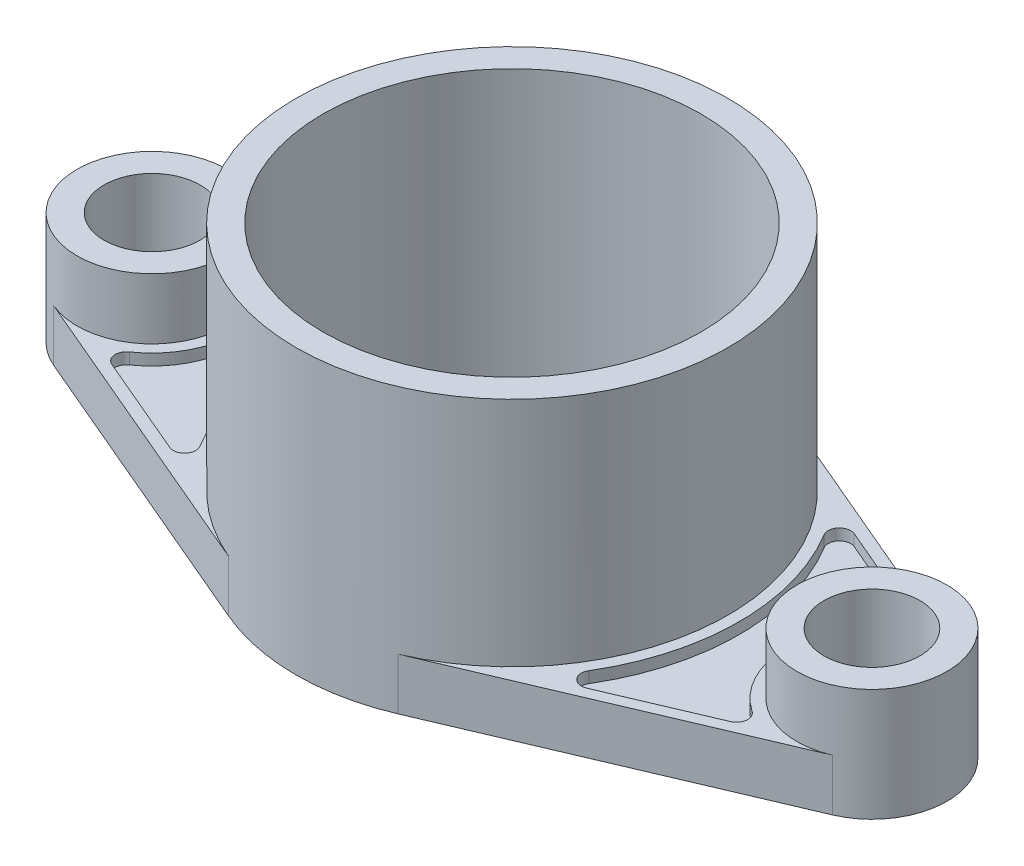
ISO-10303-21;
HEADER;
FILE_DESCRIPTION(('STEP AP214'),'2;1');
FILE_NAME('part.step','',(''),(''),'','','');
FILE_SCHEMA(('AUTOMOTIVE_DESIGN { 1 0 10303 214 1 1 1 1 }'));
ENDSEC;
DATA;
#1=APPLICATION_CONTEXT('core data for automotive mechanical design processes');
#2=APPLICATION_PROTOCOL_DEFINITION('international standard','automotive_design',2000,#1);
#3=PRODUCT_CONTEXT('',#1,'mechanical');
#4=PRODUCT('Part','Part','',(#3));
#5=PRODUCT_RELATED_PRODUCT_CATEGORY('part','',(#4));
#6=PRODUCT_DEFINITION_FORMATION('','',#4);
#7=PRODUCT_DEFINITION_CONTEXT('part definition',#1,'design');
#8=PRODUCT_DEFINITION('design','',#6,#7);
#9=PRODUCT_DEFINITION_SHAPE('','',#8);
#10=(LENGTH_UNIT() NAMED_UNIT(*) SI_UNIT(.MILLI.,.METRE.));
#11=(NAMED_UNIT(*) PLANE_ANGLE_UNIT() SI_UNIT($,.RADIAN.));
#12=(NAMED_UNIT(*) SI_UNIT($,.STERADIAN.) SOLID_ANGLE_UNIT());
#13=UNCERTAINTY_MEASURE_WITH_UNIT(LENGTH_MEASURE(1.E-05),#10,'distance_accuracy_value','');
#14=(GEOMETRIC_REPRESENTATION_CONTEXT(3) GLOBAL_UNCERTAINTY_ASSIGNED_CONTEXT((#13)) GLOBAL_UNIT_ASSIGNED_CONTEXT((#10,
#11,#12)) REPRESENTATION_CONTEXT('',''));
#15=CARTESIAN_POINT('',(0.,0.,0.));
#16=DIRECTION('',(0.,0.,1.));
#17=DIRECTION('',(1.,0.,0.));
#18=AXIS2_PLACEMENT_3D('',#15,#16,#17);
#19=CARTESIAN_POINT('',(-80.,25.,0.));
#20=DIRECTION('',(0.,-1.,0.));
#21=DIRECTION('',(0.,0.,-1.));
#22=AXIS2_PLACEMENT_3D('',#19,#20,#21);
#23=CYLINDRICAL_SURFACE('',#22,16.6666666666667);
#24=CARTESIAN_POINT('',(-80.,25.,0.));
#25=DIRECTION('',(0.,1.,0.));
#26=DIRECTION('',(0.,0.,1.));
#27=AXIS2_PLACEMENT_3D('',#24,#25,#26);
#28=CIRCLE('',#27,16.6666666666667);
#29=CARTESIAN_POINT('',(-80.,25.,16.6666666666667));
#30=VERTEX_POINT('',#29);
#31=EDGE_CURVE('E318',#30,#30,#28,.T.);
#32=ORIENTED_EDGE('',*,*,#31,.F.);
#33=EDGE_LOOP('',(#32));
#34=FACE_BOUND('',#33,.T.);
#35=DIRECTION('',(0.,-1.,0.));
#36=VECTOR('',#35,1.);
#37=CARTESIAN_POINT('',(-86.5277777777778,9.,15.3351196624522));
#38=LINE('',#37,#36);
#39=CARTESIAN_POINT('',(-86.5277777777778,11.5,15.3351196624522));
#40=VERTEX_POINT('',#39);
#41=CARTESIAN_POINT('',(-86.5277777777778,0.,15.3351196624522));
#42=VERTEX_POINT('',#41);
#43=EDGE_CURVE('E343',#40,#42,#38,.T.);
#44=ORIENTED_EDGE('',*,*,#43,.F.);
#45=CARTESIAN_POINT('',(-80.,11.5,0.));
#46=DIRECTION('',(0.,-1.,0.));
#47=DIRECTION('',(0.,0.,1.));
#48=AXIS2_PLACEMENT_3D('',#45,#46,#47);
#49=CIRCLE('',#48,16.6666666666667);
#50=CARTESIAN_POINT('',(-86.5277777777778,11.5,-15.3351196624522));
#51=VERTEX_POINT('',#50);
#52=EDGE_CURVE('E279',#51,#40,#49,.T.);
#53=ORIENTED_EDGE('',*,*,#52,.F.);
#54=DIRECTION('',(0.,-1.,0.));
#55=VECTOR('',#54,1.);
#56=CARTESIAN_POINT('',(-86.5277777777778,9.,-15.3351196624522));
#57=LINE('',#56,#55);
#58=CARTESIAN_POINT('',(-86.5277777777778,0.,-15.3351196624522));
#59=VERTEX_POINT('',#58);
#60=EDGE_CURVE('E332',#51,#59,#57,.T.);
#61=ORIENTED_EDGE('',*,*,#60,.T.);
#62=CARTESIAN_POINT('',(-80.,0.,0.));
#63=DIRECTION('',(0.,1.,0.));
#64=DIRECTION('',(0.,0.,1.));
#65=AXIS2_PLACEMENT_3D('',#62,#63,#64);
#66=CIRCLE('',#65,16.6666666666667);
#67=EDGE_CURVE('E314',#59,#42,#66,.T.);
#68=ORIENTED_EDGE('',*,*,#67,.T.);
#69=EDGE_LOOP('',(#44,#53,#61,#68));
#70=FACE_BOUND('',#69,.T.);
#71=ADVANCED_FACE('F43',(#34,#70),#23,.T.);
#72=CARTESIAN_POINT('',(0.,63.,0.));
#73=DIRECTION('',(0.,1.,0.));
#74=DIRECTION('',(0.,0.,1.));
#75=AXIS2_PLACEMENT_3D('',#72,#73,#74);
#76=PLANE('',#75);
#77=CARTESIAN_POINT('',(0.,63.,0.));
#78=DIRECTION('',(0.,1.,0.));
#79=DIRECTION('',(0.,0.,1.));
#80=AXIS2_PLACEMENT_3D('',#77,#78,#79);
#81=CIRCLE('',#80,48.);
#82=CARTESIAN_POINT('',(0.,63.,48.));
#83=VERTEX_POINT('',#82);
#84=EDGE_CURVE('E356',#83,#83,#81,.T.);
#85=ORIENTED_EDGE('',*,*,#84,.T.);
#86=EDGE_LOOP('',(#85));
#87=FACE_BOUND('',#86,.T.);
#88=CARTESIAN_POINT('',(0.,63.,0.));
#89=DIRECTION('',(0.,1.,0.));
#90=DIRECTION('',(0.,0.,1.));
#91=AXIS2_PLACEMENT_3D('',#88,#89,#90);
#92=CIRCLE('',#91,42.);
#93=CARTESIAN_POINT('',(0.,63.,42.));
#94=VERTEX_POINT('',#93);
#95=EDGE_CURVE('E348',#94,#94,#92,.T.);
#96=ORIENTED_EDGE('',*,*,#95,.F.);
#97=EDGE_LOOP('',(#96));
#98=FACE_BOUND('',#97,.T.);
#99=ADVANCED_FACE('F495',(#87,#98),#76,.T.);
#100=CARTESIAN_POINT('',(0.,0.,0.));
#101=DIRECTION('',(0.,1.,0.));
#102=DIRECTION('',(0.,0.,1.));
#103=AXIS2_PLACEMENT_3D('',#100,#101,#102);
#104=PLANE('',#103);
#105=CARTESIAN_POINT('',(0.,0.,0.));
#106=DIRECTION('',(0.,1.,0.));
#107=DIRECTION('',(0.,0.,1.));
#108=AXIS2_PLACEMENT_3D('',#105,#106,#107);
#109=CIRCLE('',#108,48.);
#110=CARTESIAN_POINT('',(-18.8,0.,44.1651446278624));
#111=VERTEX_POINT('',#110);
#112=CARTESIAN_POINT('',(18.8,0.,44.1651446278624));
#113=VERTEX_POINT('',#112);
#114=EDGE_CURVE('E361',#111,#113,#109,.T.);
#115=ORIENTED_EDGE('',*,*,#114,.F.);
#116=DIRECTION('',(0.920107179747133,0.,0.391666666666667));
#117=VECTOR('',#116,1.);
#118=CARTESIAN_POINT('',(-18.8,0.,44.1651446278624));
#119=LINE('',#118,#117);
#120=EDGE_CURVE('E322',#42,#111,#119,.T.);
#121=ORIENTED_EDGE('',*,*,#120,.F.);
#122=ORIENTED_EDGE('',*,*,#67,.F.);
#123=DIRECTION('',(-0.920107179747133,0.,0.391666666666667));
#124=VECTOR('',#123,1.);
#125=CARTESIAN_POINT('',(-86.5277777777778,0.,-15.3351196624522));
#126=LINE('',#125,#124);
#127=CARTESIAN_POINT('',(-18.8,0.,-44.1651446278624));
#128=VERTEX_POINT('',#127);
#129=EDGE_CURVE('E328',#128,#59,#126,.T.);
#130=ORIENTED_EDGE('',*,*,#129,.F.);
#131=CARTESIAN_POINT('',(18.8,0.,-44.1651446278624));
#132=VERTEX_POINT('',#131);
#133=EDGE_CURVE('E352',#132,#128,#109,.T.);
#134=ORIENTED_EDGE('',*,*,#133,.F.);
#135=DIRECTION('',(0.920107179747133,0.,0.391666666666667));
#136=VECTOR('',#135,1.);
#137=CARTESIAN_POINT('',(86.5277777777778,0.,-15.3351196624522));
#138=LINE('',#137,#136);
#139=CARTESIAN_POINT('',(86.5277777777778,0.,-15.3351196624522));
#140=VERTEX_POINT('',#139);
#141=EDGE_CURVE('E217',#132,#140,#138,.T.);
#142=ORIENTED_EDGE('',*,*,#141,.T.);
#143=CARTESIAN_POINT('',(80.,0.,0.));
#144=DIRECTION('',(0.,-1.,0.));
#145=DIRECTION('',(0.,0.,1.));
#146=AXIS2_PLACEMENT_3D('',#143,#144,#145);
#147=CIRCLE('',#146,16.6666666666667);
#148=CARTESIAN_POINT('',(86.5277777777778,0.,15.3351196624522));
#149=VERTEX_POINT('',#148);
#150=EDGE_CURVE('E584',#140,#149,#147,.T.);
#151=ORIENTED_EDGE('',*,*,#150,.T.);
#152=DIRECTION('',(-0.920107179747133,0.,0.391666666666667));
#153=VECTOR('',#152,1.);
#154=CARTESIAN_POINT('',(18.8,0.,44.1651446278624));
#155=LINE('',#154,#153);
#156=EDGE_CURVE('E223',#149,#113,#155,.T.);
#157=ORIENTED_EDGE('',*,*,#156,.T.);
#158=EDGE_LOOP('',(#115,#121,#122,#130,#134,#142,#151,#157));
#159=FACE_BOUND('',#158,.T.);
#160=CARTESIAN_POINT('',(0.,0.,0.));
#161=DIRECTION('',(0.,1.,0.));
#162=DIRECTION('',(0.,0.,1.));
#163=AXIS2_PLACEMENT_3D('',#160,#161,#162);
#164=CIRCLE('',#163,42.);
#165=CARTESIAN_POINT('',(0.,0.,42.));
#166=VERTEX_POINT('',#165);
#167=EDGE_CURVE('E347',#166,#166,#164,.T.);
#168=ORIENTED_EDGE('',*,*,#167,.T.);
#169=EDGE_LOOP('',(#168));
#170=FACE_BOUND('',#169,.T.);
#171=CARTESIAN_POINT('',(-80.,0.,0.));
#172=DIRECTION('',(0.,1.,0.));
#173=DIRECTION('',(0.,0.,1.));
#174=AXIS2_PLACEMENT_3D('',#171,#172,#173);
#175=CIRCLE('',#174,10.6666666666667);
#176=CARTESIAN_POINT('',(-80.,0.,10.6666666666667));
#177=VERTEX_POINT('',#176);
#178=EDGE_CURVE('E309',#177,#177,#175,.T.);
#179=ORIENTED_EDGE('',*,*,#178,.T.);
#180=EDGE_LOOP('',(#179));
#181=FACE_BOUND('',#180,.T.);
#182=CARTESIAN_POINT('',(80.,0.,0.));
#183=DIRECTION('',(0.,-1.,0.));
#184=DIRECTION('',(0.,0.,1.));
#185=AXIS2_PLACEMENT_3D('',#182,#183,#184);
#186=CIRCLE('',#185,10.6666666666667);
#187=CARTESIAN_POINT('',(80.,0.,10.6666666666667));
#188=VERTEX_POINT('',#187);
#189=EDGE_CURVE('E577',#188,#188,#186,.T.);
#190=ORIENTED_EDGE('',*,*,#189,.F.);
#191=EDGE_LOOP('',(#190));
#192=FACE_BOUND('',#191,.T.);
#193=ADVANCED_FACE('F472',(#159,#170,#181,#192),#104,.F.);
#194=CARTESIAN_POINT('',(0.,63.,0.));
#195=DIRECTION('',(0.,-1.,0.));
#196=DIRECTION('',(0.,0.,-1.));
#197=AXIS2_PLACEMENT_3D('',#194,#195,#196);
#198=CYLINDRICAL_SURFACE('',#197,48.);
#199=CARTESIAN_POINT('',(0.,11.5,0.));
#200=DIRECTION('',(0.,1.,0.));
#201=DIRECTION('',(0.,0.,1.));
#202=AXIS2_PLACEMENT_3D('',#199,#200,#201);
#203=CIRCLE('',#202,48.);
#204=CARTESIAN_POINT('',(18.8,11.5,44.1651446278624));
#205=VERTEX_POINT('',#204);
#206=CARTESIAN_POINT('',(18.8,11.5,-44.1651446278624));
#207=VERTEX_POINT('',#206);
#208=EDGE_CURVE('E213',#205,#207,#203,.T.);
#209=ORIENTED_EDGE('',*,*,#208,.T.);
#210=DIRECTION('',(0.,-1.,0.));
#211=VECTOR('',#210,1.);
#212=CARTESIAN_POINT('',(18.8,9.,-44.1651446278624));
#213=LINE('',#212,#211);
#214=EDGE_CURVE('E255',#207,#132,#213,.T.);
#215=ORIENTED_EDGE('',*,*,#214,.T.);
#216=ORIENTED_EDGE('',*,*,#133,.T.);
#217=DIRECTION('',(0.,-1.,0.));
#218=VECTOR('',#217,1.);
#219=CARTESIAN_POINT('',(-18.8,9.,-44.1651446278624));
#220=LINE('',#219,#218);
#221=CARTESIAN_POINT('',(-18.8,11.5,-44.1651446278624));
#222=VERTEX_POINT('',#221);
#223=EDGE_CURVE('E335',#222,#128,#220,.T.);
#224=ORIENTED_EDGE('',*,*,#223,.F.);
#225=CARTESIAN_POINT('',(0.,11.5,0.));
#226=DIRECTION('',(0.,-1.,0.));
#227=DIRECTION('',(0.,0.,1.));
#228=AXIS2_PLACEMENT_3D('',#225,#226,#227);
#229=CIRCLE('',#228,48.);
#230=CARTESIAN_POINT('',(-18.8,11.5,44.1651446278624));
#231=VERTEX_POINT('',#230);
#232=EDGE_CURVE('E301',#231,#222,#229,.T.);
#233=ORIENTED_EDGE('',*,*,#232,.F.);
#234=DIRECTION('',(0.,-1.,0.));
#235=VECTOR('',#234,1.);
#236=CARTESIAN_POINT('',(-18.8,9.,44.1651446278624));
#237=LINE('',#236,#235);
#238=EDGE_CURVE('E339',#231,#111,#237,.T.);
#239=ORIENTED_EDGE('',*,*,#238,.T.);
#240=ORIENTED_EDGE('',*,*,#114,.T.);
#241=DIRECTION('',(0.,-1.,0.));
#242=VECTOR('',#241,1.);
#243=CARTESIAN_POINT('',(18.8,9.,44.1651446278624));
#244=LINE('',#243,#242);
#245=EDGE_CURVE('E228',#205,#113,#244,.T.);
#246=ORIENTED_EDGE('',*,*,#245,.F.);
#247=EDGE_LOOP('',(#209,#215,#216,#224,#233,#239,#240,#246));
#248=FACE_BOUND('',#247,.T.);
#249=ORIENTED_EDGE('',*,*,#84,.F.);
#250=EDGE_LOOP('',(#249));
#251=FACE_BOUND('',#250,.T.);
#252=ADVANCED_FACE('F462',(#248,#251),#198,.T.);
#253=CARTESIAN_POINT('',(0.,63.,0.));
#254=DIRECTION('',(0.,-1.,0.));
#255=DIRECTION('',(0.,0.,-1.));
#256=AXIS2_PLACEMENT_3D('',#253,#254,#255);
#257=CYLINDRICAL_SURFACE('',#256,42.);
#258=ORIENTED_EDGE('',*,*,#95,.T.);
#259=EDGE_LOOP('',(#258));
#260=FACE_BOUND('',#259,.T.);
#261=ORIENTED_EDGE('',*,*,#167,.F.);
#262=EDGE_LOOP('',(#261));
#263=FACE_BOUND('',#262,.T.);
#264=ADVANCED_FACE('F484',(#260,#263),#257,.F.);
#265=CARTESIAN_POINT('',(-18.8,9.,44.1651446278624));
#266=DIRECTION('',(0.391666666666667,0.,-0.920107179747133));
#267=DIRECTION('',(-0.920107179747133,0.,-0.391666666666667));
#268=AXIS2_PLACEMENT_3D('',#265,#266,#267);
#269=PLANE('',#268);
#270=ORIENTED_EDGE('',*,*,#120,.T.);
#271=ORIENTED_EDGE('',*,*,#238,.F.);
#272=DIRECTION('',(0.920107179747133,0.,0.391666666666667));
#273=VECTOR('',#272,1.);
#274=CARTESIAN_POINT('',(-86.5277777777778,11.5,15.3351196624522));
#275=LINE('',#274,#273);
#276=EDGE_CURVE('E297',#40,#231,#275,.T.);
#277=ORIENTED_EDGE('',*,*,#276,.F.);
#278=ORIENTED_EDGE('',*,*,#43,.T.);
#279=EDGE_LOOP('',(#270,#271,#277,#278));
#280=FACE_BOUND('',#279,.T.);
#281=ADVANCED_FACE('F482',(#280),#269,.F.);
#282=CARTESIAN_POINT('',(-86.5277777777778,9.,-15.3351196624522));
#283=DIRECTION('',(0.391666666666667,0.,0.920107179747132));
#284=DIRECTION('',(0.920107179747133,0.,-0.391666666666667));
#285=AXIS2_PLACEMENT_3D('',#282,#283,#284);
#286=PLANE('',#285);
#287=ORIENTED_EDGE('',*,*,#129,.T.);
#288=ORIENTED_EDGE('',*,*,#60,.F.);
#289=DIRECTION('',(-0.920107179747133,0.,0.391666666666667));
#290=VECTOR('',#289,1.);
#291=CARTESIAN_POINT('',(-18.8,11.5,-44.1651446278624));
#292=LINE('',#291,#290);
#293=EDGE_CURVE('E305',#222,#51,#292,.T.);
#294=ORIENTED_EDGE('',*,*,#293,.F.);
#295=ORIENTED_EDGE('',*,*,#223,.T.);
#296=EDGE_LOOP('',(#287,#288,#294,#295));
#297=FACE_BOUND('',#296,.T.);
#298=ADVANCED_FACE('F470',(#297),#286,.F.);
#299=CARTESIAN_POINT('',(-80.,25.,0.));
#300=DIRECTION('',(0.,1.,0.));
#301=DIRECTION('',(0.,0.,1.));
#302=AXIS2_PLACEMENT_3D('',#299,#300,#301);
#303=PLANE('',#302);
#304=ORIENTED_EDGE('',*,*,#31,.T.);
#305=EDGE_LOOP('',(#304));
#306=FACE_BOUND('',#305,.T.);
#307=CARTESIAN_POINT('',(-80.,25.,0.));
#308=DIRECTION('',(0.,1.,0.));
#309=DIRECTION('',(0.,0.,1.));
#310=AXIS2_PLACEMENT_3D('',#307,#308,#309);
#311=CIRCLE('',#310,10.6666666666667);
#312=CARTESIAN_POINT('',(-80.,25.,10.6666666666667));
#313=VERTEX_POINT('',#312);
#314=EDGE_CURVE('E310',#313,#313,#311,.T.);
#315=ORIENTED_EDGE('',*,*,#314,.F.);
#316=EDGE_LOOP('',(#315));
#317=FACE_BOUND('',#316,.T.);
#318=ADVANCED_FACE('F490',(#306,#317),#303,.T.);
#319=CARTESIAN_POINT('',(-80.,25.,0.));
#320=DIRECTION('',(0.,-1.,0.));
#321=DIRECTION('',(0.,0.,-1.));
#322=AXIS2_PLACEMENT_3D('',#319,#320,#321);
#323=CYLINDRICAL_SURFACE('',#322,10.6666666666667);
#324=ORIENTED_EDGE('',*,*,#314,.T.);
#325=EDGE_LOOP('',(#324));
#326=FACE_BOUND('',#325,.T.);
#327=ORIENTED_EDGE('',*,*,#178,.F.);
#328=EDGE_LOOP('',(#327));
#329=FACE_BOUND('',#328,.T.);
#330=ADVANCED_FACE('F559',(#326,#329),#323,.F.);
#331=CARTESIAN_POINT('',(-80.,11.5,0.));
#332=DIRECTION('',(0.,1.,0.));
#333=DIRECTION('',(0.,0.,1.));
#334=AXIS2_PLACEMENT_3D('',#331,#332,#333);
#335=PLANE('',#334);
#336=ORIENTED_EDGE('',*,*,#52,.T.);
#337=ORIENTED_EDGE('',*,*,#276,.T.);
#338=ORIENTED_EDGE('',*,*,#232,.T.);
#339=ORIENTED_EDGE('',*,*,#293,.T.);
#340=EDGE_LOOP('',(#336,#337,#338,#339));
#341=FACE_BOUND('',#340,.T.);
#342=DIRECTION('',(-0.920107179747133,0.,0.391666666666667));
#343=VECTOR('',#342,1.);
#344=CARTESIAN_POINT('',(-37.979371640132,11.5,-33.2838899442469));
#345=LINE('',#344,#343);
#346=CARTESIAN_POINT('',(-46.3293116044255,11.5,-29.729528860378));
#347=VERTEX_POINT('',#346);
#348=CARTESIAN_POINT('',(-68.7498291887789,11.5,-20.185673991624));
#349=VERTEX_POINT('',#348);
#350=EDGE_CURVE('E266',#347,#349,#345,.T.);
#351=ORIENTED_EDGE('',*,*,#350,.F.);
#352=CARTESIAN_POINT('',(-45.3501449377588,11.5,-27.4292609110101));
#353=DIRECTION('',(0.,1.,0.));
#354=DIRECTION('',(0.,0.,1.));
#355=AXIS2_PLACEMENT_3D('',#352,#353,#354);
#356=CIRCLE('',#355,2.5);
#357=CARTESIAN_POINT('',(-43.2109871576759,11.5,-26.13542784917));
#358=VERTEX_POINT('',#357);
#359=EDGE_CURVE('E409',#347,#358,#356,.F.);
#360=ORIENTED_EDGE('',*,*,#359,.T.);
#361=CARTESIAN_POINT('',(0.,11.5,0.));
#362=DIRECTION('',(0.,-1.,0.));
#363=DIRECTION('',(0.,0.,1.));
#364=AXIS2_PLACEMENT_3D('',#361,#362,#363);
#365=CIRCLE('',#364,50.5);
#366=CARTESIAN_POINT('',(-43.2109871576759,11.5,26.13542784917));
#367=VERTEX_POINT('',#366);
#368=EDGE_CURVE('E262',#367,#358,#365,.T.);
#369=ORIENTED_EDGE('',*,*,#368,.F.);
#370=CARTESIAN_POINT('',(-45.3501449377588,11.5,27.4292609110101));
#371=DIRECTION('',(0.,1.,0.));
#372=DIRECTION('',(0.,0.,1.));
#373=AXIS2_PLACEMENT_3D('',#370,#371,#372);
#374=CIRCLE('',#373,2.5);
#375=CARTESIAN_POINT('',(-46.3293116044255,11.5,29.729528860378));
#376=VERTEX_POINT('',#375);
#377=EDGE_CURVE('E403',#367,#376,#374,.F.);
#378=ORIENTED_EDGE('',*,*,#377,.T.);
#379=DIRECTION('',(0.920107179747133,0.,0.391666666666667));
#380=VECTOR('',#379,1.);
#381=CARTESIAN_POINT('',(-73.6700784981561,11.5,18.0912466372996));
#382=LINE('',#381,#380);
#383=CARTESIAN_POINT('',(-68.7498291887789,11.5,20.185673991624));
#384=VERTEX_POINT('',#383);
#385=EDGE_CURVE('E275',#384,#376,#382,.T.);
#386=ORIENTED_EDGE('',*,*,#385,.F.);
#387=CARTESIAN_POINT('',(-67.7706625221123,11.5,17.8854060422562));
#388=DIRECTION('',(0.,1.,0.));
#389=DIRECTION('',(0.,0.,1.));
#390=AXIS2_PLACEMENT_3D('',#387,#388,#389);
#391=CIRCLE('',#390,2.5);
#392=CARTESIAN_POINT('',(-69.181739923407,11.5,15.8217053450728));
#393=VERTEX_POINT('',#392);
#394=EDGE_CURVE('E406',#384,#393,#391,.F.);
#395=ORIENTED_EDGE('',*,*,#394,.T.);
#396=CARTESIAN_POINT('',(-80.,11.5,0.));
#397=DIRECTION('',(0.,-1.,0.));
#398=DIRECTION('',(0.,0.,1.));
#399=AXIS2_PLACEMENT_3D('',#396,#397,#398);
#400=CIRCLE('',#399,19.1666666666667);
#401=CARTESIAN_POINT('',(-69.181739923407,11.5,-15.8217053450728));
#402=VERTEX_POINT('',#401);
#403=EDGE_CURVE('E271',#402,#393,#400,.T.);
#404=ORIENTED_EDGE('',*,*,#403,.F.);
#405=CARTESIAN_POINT('',(-67.7706625221123,11.5,-17.8854060422562));
#406=DIRECTION('',(0.,1.,0.));
#407=DIRECTION('',(0.,0.,1.));
#408=AXIS2_PLACEMENT_3D('',#405,#406,#407);
#409=CIRCLE('',#408,2.5);
#410=EDGE_CURVE('E412',#402,#349,#409,.F.);
#411=ORIENTED_EDGE('',*,*,#410,.T.);
#412=EDGE_LOOP('',(#351,#360,#369,#378,#386,#395,#404,#411));
#413=FACE_BOUND('',#412,.T.);
#414=ADVANCED_FACE('F479',(#341,#413),#335,.T.);
#415=CARTESIAN_POINT('',(0.,11.5,0.));
#416=DIRECTION('',(0.,-1.,0.));
#417=DIRECTION('',(0.,0.,-1.));
#418=AXIS2_PLACEMENT_3D('',#415,#416,#417);
#419=CYLINDRICAL_SURFACE('',#418,50.5);
#420=CARTESIAN_POINT('',(0.,9.,0.));
#421=DIRECTION('',(0.,-1.,0.));
#422=DIRECTION('',(0.,0.,1.));
#423=AXIS2_PLACEMENT_3D('',#420,#421,#422);
#424=CIRCLE('',#423,50.5);
#425=CARTESIAN_POINT('',(-43.2109871576759,9.,26.13542784917));
#426=VERTEX_POINT('',#425);
#427=CARTESIAN_POINT('',(-43.2109871576759,9.,-26.13542784917));
#428=VERTEX_POINT('',#427);
#429=EDGE_CURVE('E261',#426,#428,#424,.T.);
#430=ORIENTED_EDGE('',*,*,#429,.F.);
#431=DIRECTION('',(0.,-1.,0.));
#432=VECTOR('',#431,1.);
#433=CARTESIAN_POINT('',(-43.2109871576759,11.5,26.13542784917));
#434=LINE('',#433,#432);
#435=EDGE_CURVE('E386',#426,#367,#434,.F.);
#436=ORIENTED_EDGE('',*,*,#435,.T.);
#437=ORIENTED_EDGE('',*,*,#368,.T.);
#438=DIRECTION('',(0.,-1.,0.));
#439=VECTOR('',#438,1.);
#440=CARTESIAN_POINT('',(-43.2109871576759,11.5,-26.13542784917));
#441=LINE('',#440,#439);
#442=EDGE_CURVE('E382',#358,#428,#441,.T.);
#443=ORIENTED_EDGE('',*,*,#442,.T.);
#444=EDGE_LOOP('',(#430,#436,#437,#443));
#445=FACE_BOUND('',#444,.T.);
#446=ADVANCED_FACE('F550',(#445),#419,.T.);
#447=CARTESIAN_POINT('',(-37.979371640132,11.5,-33.2838899442469));
#448=DIRECTION('',(0.391666666666667,0.,0.920107179747133));
#449=DIRECTION('',(0.920107179747133,0.,-0.391666666666667));
#450=AXIS2_PLACEMENT_3D('',#447,#448,#449);
#451=PLANE('',#450);
#452=DIRECTION('',(-0.920107179747133,0.,0.391666666666667));
#453=VECTOR('',#452,1.);
#454=CARTESIAN_POINT('',(-37.979371640132,9.,-33.2838899442469));
#455=LINE('',#454,#453);
#456=CARTESIAN_POINT('',(-46.3293116044255,9.,-29.729528860378));
#457=VERTEX_POINT('',#456);
#458=CARTESIAN_POINT('',(-68.7498291887789,9.,-20.185673991624));
#459=VERTEX_POINT('',#458);
#460=EDGE_CURVE('E283',#457,#459,#455,.T.);
#461=ORIENTED_EDGE('',*,*,#460,.F.);
#462=DIRECTION('',(0.,1.,0.));
#463=VECTOR('',#462,1.);
#464=CARTESIAN_POINT('',(-46.3293116044255,11.5,-29.729528860378));
#465=LINE('',#464,#463);
#466=EDGE_CURVE('E400',#457,#347,#465,.T.);
#467=ORIENTED_EDGE('',*,*,#466,.T.);
#468=ORIENTED_EDGE('',*,*,#350,.T.);
#469=DIRECTION('',(0.,1.,0.));
#470=VECTOR('',#469,1.);
#471=CARTESIAN_POINT('',(-68.7498291887789,9.,-20.185673991624));
#472=LINE('',#471,#470);
#473=EDGE_CURVE('E396',#349,#459,#472,.F.);
#474=ORIENTED_EDGE('',*,*,#473,.T.);
#475=EDGE_LOOP('',(#461,#467,#468,#474));
#476=FACE_BOUND('',#475,.T.);
#477=ADVANCED_FACE('F542',(#476),#451,.T.);
#478=CARTESIAN_POINT('',(-80.,11.5,0.));
#479=DIRECTION('',(0.,-1.,0.));
#480=DIRECTION('',(0.,0.,-1.));
#481=AXIS2_PLACEMENT_3D('',#478,#479,#480);
#482=CYLINDRICAL_SURFACE('',#481,19.1666666666667);
#483=ORIENTED_EDGE('',*,*,#403,.T.);
#484=DIRECTION('',(0.,-1.,0.));
#485=VECTOR('',#484,1.);
#486=CARTESIAN_POINT('',(-69.181739923407,11.5,15.8217053450728));
#487=LINE('',#486,#485);
#488=CARTESIAN_POINT('',(-69.181739923407,9.,15.8217053450728));
#489=VERTEX_POINT('',#488);
#490=EDGE_CURVE('E392',#393,#489,#487,.T.);
#491=ORIENTED_EDGE('',*,*,#490,.T.);
#492=CARTESIAN_POINT('',(-80.,9.,0.));
#493=DIRECTION('',(0.,-1.,0.));
#494=DIRECTION('',(0.,0.,1.));
#495=AXIS2_PLACEMENT_3D('',#492,#493,#494);
#496=CIRCLE('',#495,19.1666666666667);
#497=CARTESIAN_POINT('',(-69.181739923407,9.,-15.8217053450728));
#498=VERTEX_POINT('',#497);
#499=EDGE_CURVE('E287',#498,#489,#496,.T.);
#500=ORIENTED_EDGE('',*,*,#499,.F.);
#501=DIRECTION('',(0.,-1.,0.));
#502=VECTOR('',#501,1.);
#503=CARTESIAN_POINT('',(-69.181739923407,11.5,-15.8217053450728));
#504=LINE('',#503,#502);
#505=EDGE_CURVE('E389',#498,#402,#504,.F.);
#506=ORIENTED_EDGE('',*,*,#505,.T.);
#507=EDGE_LOOP('',(#483,#491,#500,#506));
#508=FACE_BOUND('',#507,.T.);
#509=ADVANCED_FACE('F519',(#508),#482,.T.);
#510=CARTESIAN_POINT('',(-73.6700784981561,11.5,18.0912466372996));
#511=DIRECTION('',(0.391666666666667,0.,-0.920107179747133));
#512=DIRECTION('',(-0.920107179747133,0.,-0.391666666666667));
#513=AXIS2_PLACEMENT_3D('',#510,#511,#512);
#514=PLANE('',#513);
#515=ORIENTED_EDGE('',*,*,#385,.T.);
#516=DIRECTION('',(0.,1.,0.));
#517=VECTOR('',#516,1.);
#518=CARTESIAN_POINT('',(-46.3293116044255,9.,29.729528860378));
#519=LINE('',#518,#517);
#520=CARTESIAN_POINT('',(-46.3293116044255,9.,29.729528860378));
#521=VERTEX_POINT('',#520);
#522=EDGE_CURVE('E366',#376,#521,#519,.F.);
#523=ORIENTED_EDGE('',*,*,#522,.T.);
#524=DIRECTION('',(0.920107179747133,0.,0.391666666666667));
#525=VECTOR('',#524,1.);
#526=CARTESIAN_POINT('',(-73.6700784981561,9.,18.0912466372996));
#527=LINE('',#526,#525);
#528=CARTESIAN_POINT('',(-68.7498291887789,9.,20.185673991624));
#529=VERTEX_POINT('',#528);
#530=EDGE_CURVE('E267',#529,#521,#527,.T.);
#531=ORIENTED_EDGE('',*,*,#530,.F.);
#532=DIRECTION('',(0.,1.,0.));
#533=VECTOR('',#532,1.);
#534=CARTESIAN_POINT('',(-68.7498291887789,11.5,20.185673991624));
#535=LINE('',#534,#533);
#536=EDGE_CURVE('E360',#529,#384,#535,.T.);
#537=ORIENTED_EDGE('',*,*,#536,.T.);
#538=EDGE_LOOP('',(#515,#523,#531,#537));
#539=FACE_BOUND('',#538,.T.);
#540=ADVANCED_FACE('F510',(#539),#514,.T.);
#541=CARTESIAN_POINT('',(-80.,9.,0.));
#542=DIRECTION('',(0.,1.,0.));
#543=DIRECTION('',(0.,0.,1.));
#544=AXIS2_PLACEMENT_3D('',#541,#542,#543);
#545=PLANE('',#544);
#546=ORIENTED_EDGE('',*,*,#530,.T.);
#547=CARTESIAN_POINT('',(-45.3501449377588,9.,27.4292609110101));
#548=DIRECTION('',(0.,1.,0.));
#549=DIRECTION('',(0.,0.,1.));
#550=AXIS2_PLACEMENT_3D('',#547,#548,#549);
#551=CIRCLE('',#550,2.5);
#552=EDGE_CURVE('E379',#521,#426,#551,.T.);
#553=ORIENTED_EDGE('',*,*,#552,.T.);
#554=ORIENTED_EDGE('',*,*,#429,.T.);
#555=CARTESIAN_POINT('',(-45.3501449377588,9.,-27.4292609110101));
#556=DIRECTION('',(0.,1.,0.));
#557=DIRECTION('',(0.,0.,1.));
#558=AXIS2_PLACEMENT_3D('',#555,#556,#557);
#559=CIRCLE('',#558,2.5);
#560=EDGE_CURVE('E373',#428,#457,#559,.T.);
#561=ORIENTED_EDGE('',*,*,#560,.T.);
#562=ORIENTED_EDGE('',*,*,#460,.T.);
#563=CARTESIAN_POINT('',(-67.7706625221123,9.,-17.8854060422562));
#564=DIRECTION('',(0.,1.,0.));
#565=DIRECTION('',(0.,0.,1.));
#566=AXIS2_PLACEMENT_3D('',#563,#564,#565);
#567=CIRCLE('',#566,2.5);
#568=EDGE_CURVE('E370',#459,#498,#567,.T.);
#569=ORIENTED_EDGE('',*,*,#568,.T.);
#570=ORIENTED_EDGE('',*,*,#499,.T.);
#571=CARTESIAN_POINT('',(-67.7706625221123,9.,17.8854060422562));
#572=DIRECTION('',(0.,1.,0.));
#573=DIRECTION('',(0.,0.,1.));
#574=AXIS2_PLACEMENT_3D('',#571,#572,#573);
#575=CIRCLE('',#574,2.5);
#576=EDGE_CURVE('E376',#489,#529,#575,.T.);
#577=ORIENTED_EDGE('',*,*,#576,.T.);
#578=EDGE_LOOP('',(#546,#553,#554,#561,#562,#569,#570,#577));
#579=FACE_BOUND('',#578,.T.);
#580=ADVANCED_FACE('F507',(#579),#545,.T.);
#581=CARTESIAN_POINT('',(-45.3501449377588,11.5,27.4292609110101));
#582=DIRECTION('',(0.,-1.,0.));
#583=DIRECTION('',(0.,0.,-1.));
#584=AXIS2_PLACEMENT_3D('',#581,#582,#583);
#585=CYLINDRICAL_SURFACE('',#584,2.5);
#586=ORIENTED_EDGE('',*,*,#377,.F.);
#587=ORIENTED_EDGE('',*,*,#435,.F.);
#588=ORIENTED_EDGE('',*,*,#552,.F.);
#589=ORIENTED_EDGE('',*,*,#522,.F.);
#590=EDGE_LOOP('',(#586,#587,#588,#589));
#591=FACE_BOUND('',#590,.T.);
#592=ADVANCED_FACE('F509',(#591),#585,.F.);
#593=CARTESIAN_POINT('',(-67.7706625221123,11.5,17.8854060422562));
#594=DIRECTION('',(0.,-1.,0.));
#595=DIRECTION('',(0.,0.,-1.));
#596=AXIS2_PLACEMENT_3D('',#593,#594,#595);
#597=CYLINDRICAL_SURFACE('',#596,2.5);
#598=ORIENTED_EDGE('',*,*,#394,.F.);
#599=ORIENTED_EDGE('',*,*,#536,.F.);
#600=ORIENTED_EDGE('',*,*,#576,.F.);
#601=ORIENTED_EDGE('',*,*,#490,.F.);
#602=EDGE_LOOP('',(#598,#599,#600,#601));
#603=FACE_BOUND('',#602,.T.);
#604=ADVANCED_FACE('F516',(#603),#597,.F.);
#605=CARTESIAN_POINT('',(-45.3501449377588,11.5,-27.4292609110101));
#606=DIRECTION('',(0.,-1.,0.));
#607=DIRECTION('',(0.,0.,-1.));
#608=AXIS2_PLACEMENT_3D('',#605,#606,#607);
#609=CYLINDRICAL_SURFACE('',#608,2.5);
#610=ORIENTED_EDGE('',*,*,#359,.F.);
#611=ORIENTED_EDGE('',*,*,#466,.F.);
#612=ORIENTED_EDGE('',*,*,#560,.F.);
#613=ORIENTED_EDGE('',*,*,#442,.F.);
#614=EDGE_LOOP('',(#610,#611,#612,#613));
#615=FACE_BOUND('',#614,.T.);
#616=ADVANCED_FACE('F545',(#615),#609,.F.);
#617=CARTESIAN_POINT('',(-67.7706625221123,11.5,-17.8854060422562));
#618=DIRECTION('',(0.,-1.,0.));
#619=DIRECTION('',(0.,0.,-1.));
#620=AXIS2_PLACEMENT_3D('',#617,#618,#619);
#621=CYLINDRICAL_SURFACE('',#620,2.5);
#622=ORIENTED_EDGE('',*,*,#410,.F.);
#623=ORIENTED_EDGE('',*,*,#505,.F.);
#624=ORIENTED_EDGE('',*,*,#568,.F.);
#625=ORIENTED_EDGE('',*,*,#473,.F.);
#626=EDGE_LOOP('',(#622,#623,#624,#625));
#627=FACE_BOUND('',#626,.T.);
#628=ADVANCED_FACE('F537',(#627),#621,.F.);
#629=CARTESIAN_POINT('',(86.5277777777778,9.,-15.3351196624522));
#630=DIRECTION('',(0.391666666666667,0.,-0.920107179747132));
#631=DIRECTION('',(-0.920107179747133,0.,-0.391666666666667));
#632=AXIS2_PLACEMENT_3D('',#629,#630,#631);
#633=PLANE('',#632);
#634=ORIENTED_EDGE('',*,*,#141,.F.);
#635=ORIENTED_EDGE('',*,*,#214,.F.);
#636=DIRECTION('',(0.920107179747133,0.,0.391666666666667));
#637=VECTOR('',#636,1.);
#638=CARTESIAN_POINT('',(18.8,11.5,-44.1651446278624));
#639=LINE('',#638,#637);
#640=CARTESIAN_POINT('',(86.5277777777778,11.5,-15.3351196624522));
#641=VERTEX_POINT('',#640);
#642=EDGE_CURVE('E234',#207,#641,#639,.T.);
#643=ORIENTED_EDGE('',*,*,#642,.T.);
#644=DIRECTION('',(0.,-1.,0.));
#645=VECTOR('',#644,1.);
#646=CARTESIAN_POINT('',(86.5277777777778,9.,-15.3351196624522));
#647=LINE('',#646,#645);
#648=EDGE_CURVE('E232',#641,#140,#647,.T.);
#649=ORIENTED_EDGE('',*,*,#648,.T.);
#650=EDGE_LOOP('',(#634,#635,#643,#649));
#651=FACE_BOUND('',#650,.T.);
#652=ADVANCED_FACE('F660',(#651),#633,.T.);
#653=CARTESIAN_POINT('',(18.8,9.,44.1651446278624));
#654=DIRECTION('',(0.391666666666667,0.,0.920107179747133));
#655=DIRECTION('',(0.920107179747133,0.,-0.391666666666667));
#656=AXIS2_PLACEMENT_3D('',#653,#654,#655);
#657=PLANE('',#656);
#658=ORIENTED_EDGE('',*,*,#156,.F.);
#659=DIRECTION('',(0.,-1.,0.));
#660=VECTOR('',#659,1.);
#661=CARTESIAN_POINT('',(86.5277777777778,9.,15.3351196624522));
#662=LINE('',#661,#660);
#663=CARTESIAN_POINT('',(86.5277777777778,11.5,15.3351196624522));
#664=VERTEX_POINT('',#663);
#665=EDGE_CURVE('E220',#664,#149,#662,.T.);
#666=ORIENTED_EDGE('',*,*,#665,.F.);
#667=DIRECTION('',(-0.920107179747133,0.,0.391666666666667));
#668=VECTOR('',#667,1.);
#669=CARTESIAN_POINT('',(86.5277777777778,11.5,15.3351196624522));
#670=LINE('',#669,#668);
#671=EDGE_CURVE('E205',#664,#205,#670,.T.);
#672=ORIENTED_EDGE('',*,*,#671,.T.);
#673=ORIENTED_EDGE('',*,*,#245,.T.);
#674=EDGE_LOOP('',(#658,#666,#672,#673));
#675=FACE_BOUND('',#674,.T.);
#676=ADVANCED_FACE('F221',(#675),#657,.T.);
#677=CARTESIAN_POINT('',(80.,11.5,0.));
#678=DIRECTION('',(0.,1.,0.));
#679=DIRECTION('',(0.,0.,1.));
#680=AXIS2_PLACEMENT_3D('',#677,#678,#679);
#681=PLANE('',#680);
#682=DIRECTION('',(-0.920107179747133,0.,0.391666666666667));
#683=VECTOR('',#682,1.);
#684=CARTESIAN_POINT('',(73.6700784981561,11.5,18.0912466372996));
#685=LINE('',#684,#683);
#686=CARTESIAN_POINT('',(68.7498291887789,11.5,20.185673991624));
#687=VERTEX_POINT('',#686);
#688=CARTESIAN_POINT('',(46.3293116044255,11.5,29.729528860378));
#689=VERTEX_POINT('',#688);
#690=EDGE_CURVE('E597',#687,#689,#685,.T.);
#691=ORIENTED_EDGE('',*,*,#690,.T.);
#692=CARTESIAN_POINT('',(45.3501449377588,11.5,27.4292609110101));
#693=DIRECTION('',(0.,1.,0.));
#694=DIRECTION('',(0.,0.,1.));
#695=AXIS2_PLACEMENT_3D('',#692,#693,#694);
#696=CIRCLE('',#695,2.5);
#697=CARTESIAN_POINT('',(43.2109871576759,11.5,26.13542784917));
#698=VERTEX_POINT('',#697);
#699=EDGE_CURVE('E454',#689,#698,#696,.F.);
#700=ORIENTED_EDGE('',*,*,#699,.T.);
#701=CARTESIAN_POINT('',(0.,11.5,0.));
#702=DIRECTION('',(0.,1.,0.));
#703=DIRECTION('',(0.,0.,1.));
#704=AXIS2_PLACEMENT_3D('',#701,#702,#703);
#705=CIRCLE('',#704,50.5);
#706=CARTESIAN_POINT('',(43.2109871576759,11.5,-26.13542784917));
#707=VERTEX_POINT('',#706);
#708=EDGE_CURVE('E594',#698,#707,#705,.T.);
#709=ORIENTED_EDGE('',*,*,#708,.T.);
#710=CARTESIAN_POINT('',(45.3501449377588,11.5,-27.4292609110101));
#711=DIRECTION('',(0.,1.,0.));
#712=DIRECTION('',(0.,0.,1.));
#713=AXIS2_PLACEMENT_3D('',#710,#711,#712);
#714=CIRCLE('',#713,2.5);
#715=CARTESIAN_POINT('',(46.3293116044255,11.5,-29.729528860378));
#716=VERTEX_POINT('',#715);
#717=EDGE_CURVE('E52',#707,#716,#714,.F.);
#718=ORIENTED_EDGE('',*,*,#717,.T.);
#719=DIRECTION('',(0.920107179747133,0.,0.391666666666667));
#720=VECTOR('',#719,1.);
#721=CARTESIAN_POINT('',(37.979371640132,11.5,-33.2838899442469));
#722=LINE('',#721,#720);
#723=CARTESIAN_POINT('',(68.7498291887789,11.5,-20.185673991624));
#724=VERTEX_POINT('',#723);
#725=EDGE_CURVE('E235',#716,#724,#722,.T.);
#726=ORIENTED_EDGE('',*,*,#725,.T.);
#727=CARTESIAN_POINT('',(67.7706625221123,11.5,-17.8854060422562));
#728=DIRECTION('',(0.,1.,0.));
#729=DIRECTION('',(0.,0.,1.));
#730=AXIS2_PLACEMENT_3D('',#727,#728,#729);
#731=CIRCLE('',#730,2.5);
#732=CARTESIAN_POINT('',(69.181739923407,11.5,-15.8217053450728));
#733=VERTEX_POINT('',#732);
#734=EDGE_CURVE('E11',#724,#733,#731,.F.);
#735=ORIENTED_EDGE('',*,*,#734,.T.);
#736=CARTESIAN_POINT('',(80.,11.5,0.));
#737=DIRECTION('',(0.,1.,0.));
#738=DIRECTION('',(0.,0.,1.));
#739=AXIS2_PLACEMENT_3D('',#736,#737,#738);
#740=CIRCLE('',#739,19.1666666666667);
#741=CARTESIAN_POINT('',(69.181739923407,11.5,15.8217053450728));
#742=VERTEX_POINT('',#741);
#743=EDGE_CURVE('E240',#733,#742,#740,.T.);
#744=ORIENTED_EDGE('',*,*,#743,.T.);
#745=CARTESIAN_POINT('',(67.7706625221123,11.5,17.8854060422562));
#746=DIRECTION('',(0.,1.,0.));
#747=DIRECTION('',(0.,0.,1.));
#748=AXIS2_PLACEMENT_3D('',#745,#746,#747);
#749=CIRCLE('',#748,2.5);
#750=EDGE_CURVE('E457',#742,#687,#749,.F.);
#751=ORIENTED_EDGE('',*,*,#750,.T.);
#752=EDGE_LOOP('',(#691,#700,#709,#718,#726,#735,#744,#751));
#753=FACE_BOUND('',#752,.T.);
#754=CARTESIAN_POINT('',(80.,11.5,0.));
#755=DIRECTION('',(0.,1.,0.));
#756=DIRECTION('',(0.,0.,1.));
#757=AXIS2_PLACEMENT_3D('',#754,#755,#756);
#758=CIRCLE('',#757,16.6666666666667);
#759=EDGE_CURVE('E210',#641,#664,#758,.T.);
#760=ORIENTED_EDGE('',*,*,#759,.F.);
#761=ORIENTED_EDGE('',*,*,#642,.F.);
#762=ORIENTED_EDGE('',*,*,#208,.F.);
#763=ORIENTED_EDGE('',*,*,#671,.F.);
#764=EDGE_LOOP('',(#760,#761,#762,#763));
#765=FACE_BOUND('',#764,.T.);
#766=ADVANCED_FACE('F207',(#753,#765),#681,.T.);
#767=CARTESIAN_POINT('',(0.,11.5,0.));
#768=DIRECTION('',(0.,-1.,0.));
#769=DIRECTION('',(0.,0.,-1.));
#770=AXIS2_PLACEMENT_3D('',#767,#768,#769);
#771=CYLINDRICAL_SURFACE('',#770,50.5);
#772=ORIENTED_EDGE('',*,*,#708,.F.);
#773=DIRECTION('',(0.,-1.,0.));
#774=VECTOR('',#773,1.);
#775=CARTESIAN_POINT('',(43.2109871576759,11.5,26.13542784917));
#776=LINE('',#775,#774);
#777=CARTESIAN_POINT('',(43.2109871576759,9.,26.13542784917));
#778=VERTEX_POINT('',#777);
#779=EDGE_CURVE('E418',#698,#778,#776,.T.);
#780=ORIENTED_EDGE('',*,*,#779,.T.);
#781=CARTESIAN_POINT('',(0.,9.,0.));
#782=DIRECTION('',(0.,1.,0.));
#783=DIRECTION('',(0.,0.,1.));
#784=AXIS2_PLACEMENT_3D('',#781,#782,#783);
#785=CIRCLE('',#784,50.5);
#786=CARTESIAN_POINT('',(43.2109871576759,9.,-26.13542784917));
#787=VERTEX_POINT('',#786);
#788=EDGE_CURVE('E591',#778,#787,#785,.T.);
#789=ORIENTED_EDGE('',*,*,#788,.T.);
#790=DIRECTION('',(0.,-1.,0.));
#791=VECTOR('',#790,1.);
#792=CARTESIAN_POINT('',(43.2109871576759,11.5,-26.13542784917));
#793=LINE('',#792,#791);
#794=EDGE_CURVE('E415',#787,#707,#793,.F.);
#795=ORIENTED_EDGE('',*,*,#794,.T.);
#796=EDGE_LOOP('',(#772,#780,#789,#795));
#797=FACE_BOUND('',#796,.T.);
#798=ADVANCED_FACE('F641',(#797),#771,.T.);
#799=CARTESIAN_POINT('',(73.6700784981561,11.5,18.0912466372996));
#800=DIRECTION('',(0.391666666666667,0.,0.920107179747133));
#801=DIRECTION('',(0.920107179747133,0.,-0.391666666666667));
#802=AXIS2_PLACEMENT_3D('',#799,#800,#801);
#803=PLANE('',#802);
#804=DIRECTION('',(-0.920107179747133,0.,0.391666666666667));
#805=VECTOR('',#804,1.);
#806=CARTESIAN_POINT('',(73.6700784981561,9.,18.0912466372996));
#807=LINE('',#806,#805);
#808=CARTESIAN_POINT('',(68.7498291887789,9.,20.185673991624));
#809=VERTEX_POINT('',#808);
#810=CARTESIAN_POINT('',(46.3293116044255,9.,29.729528860378));
#811=VERTEX_POINT('',#810);
#812=EDGE_CURVE('E607',#809,#811,#807,.T.);
#813=ORIENTED_EDGE('',*,*,#812,.T.);
#814=DIRECTION('',(0.,1.,0.));
#815=VECTOR('',#814,1.);
#816=CARTESIAN_POINT('',(46.3293116044255,11.5,29.729528860378));
#817=LINE('',#816,#815);
#818=EDGE_CURVE('E438',#811,#689,#817,.T.);
#819=ORIENTED_EDGE('',*,*,#818,.T.);
#820=ORIENTED_EDGE('',*,*,#690,.F.);
#821=DIRECTION('',(0.,1.,0.));
#822=VECTOR('',#821,1.);
#823=CARTESIAN_POINT('',(68.7498291887789,9.,20.185673991624));
#824=LINE('',#823,#822);
#825=EDGE_CURVE('E434',#687,#809,#824,.F.);
#826=ORIENTED_EDGE('',*,*,#825,.T.);
#827=EDGE_LOOP('',(#813,#819,#820,#826));
#828=FACE_BOUND('',#827,.T.);
#829=ADVANCED_FACE('F633',(#828),#803,.F.);
#830=CARTESIAN_POINT('',(80.,11.5,0.));
#831=DIRECTION('',(0.,-1.,0.));
#832=DIRECTION('',(0.,0.,-1.));
#833=AXIS2_PLACEMENT_3D('',#830,#831,#832);
#834=CYLINDRICAL_SURFACE('',#833,19.1666666666667);
#835=CARTESIAN_POINT('',(80.,9.,0.));
#836=DIRECTION('',(0.,1.,0.));
#837=DIRECTION('',(0.,0.,1.));
#838=AXIS2_PLACEMENT_3D('',#835,#836,#837);
#839=CIRCLE('',#838,19.1666666666667);
#840=CARTESIAN_POINT('',(69.181739923407,9.,-15.8217053450728));
#841=VERTEX_POINT('',#840);
#842=CARTESIAN_POINT('',(69.181739923407,9.,15.8217053450728));
#843=VERTEX_POINT('',#842);
#844=EDGE_CURVE('E610',#841,#843,#839,.T.);
#845=ORIENTED_EDGE('',*,*,#844,.T.);
#846=DIRECTION('',(0.,-1.,0.));
#847=VECTOR('',#846,1.);
#848=CARTESIAN_POINT('',(69.181739923407,11.5,15.8217053450728));
#849=LINE('',#848,#847);
#850=EDGE_CURVE('E445',#843,#742,#849,.F.);
#851=ORIENTED_EDGE('',*,*,#850,.T.);
#852=ORIENTED_EDGE('',*,*,#743,.F.);
#853=DIRECTION('',(0.,-1.,0.));
#854=VECTOR('',#853,1.);
#855=CARTESIAN_POINT('',(69.181739923407,11.5,-15.8217053450728));
#856=LINE('',#855,#854);
#857=EDGE_CURVE('E441',#733,#841,#856,.T.);
#858=ORIENTED_EDGE('',*,*,#857,.T.);
#859=EDGE_LOOP('',(#845,#851,#852,#858));
#860=FACE_BOUND('',#859,.T.);
#861=ADVANCED_FACE('F626',(#860),#834,.T.);
#862=CARTESIAN_POINT('',(37.979371640132,11.5,-33.2838899442469));
#863=DIRECTION('',(0.391666666666667,0.,-0.920107179747133));
#864=DIRECTION('',(-0.920107179747133,0.,-0.391666666666667));
#865=AXIS2_PLACEMENT_3D('',#862,#863,#864);
#866=PLANE('',#865);
#867=ORIENTED_EDGE('',*,*,#725,.F.);
#868=DIRECTION('',(0.,1.,0.));
#869=VECTOR('',#868,1.);
#870=CARTESIAN_POINT('',(46.3293116044255,9.,-29.729528860378));
#871=LINE('',#870,#869);
#872=CARTESIAN_POINT('',(46.3293116044255,9.,-29.729528860378));
#873=VERTEX_POINT('',#872);
#874=EDGE_CURVE('E450',#716,#873,#871,.F.);
#875=ORIENTED_EDGE('',*,*,#874,.T.);
#876=DIRECTION('',(0.920107179747133,0.,0.391666666666667));
#877=VECTOR('',#876,1.);
#878=CARTESIAN_POINT('',(37.979371640132,9.,-33.2838899442469));
#879=LINE('',#878,#877);
#880=CARTESIAN_POINT('',(68.7498291887789,9.,-20.185673991624));
#881=VERTEX_POINT('',#880);
#882=EDGE_CURVE('E243',#873,#881,#879,.T.);
#883=ORIENTED_EDGE('',*,*,#882,.T.);
#884=DIRECTION('',(0.,1.,0.));
#885=VECTOR('',#884,1.);
#886=CARTESIAN_POINT('',(68.7498291887789,11.5,-20.185673991624));
#887=LINE('',#886,#885);
#888=EDGE_CURVE('E59',#881,#724,#887,.T.);
#889=ORIENTED_EDGE('',*,*,#888,.T.);
#890=EDGE_LOOP('',(#867,#875,#883,#889));
#891=FACE_BOUND('',#890,.T.);
#892=ADVANCED_FACE('F618',(#891),#866,.F.);
#893=CARTESIAN_POINT('',(80.,9.,0.));
#894=DIRECTION('',(0.,1.,0.));
#895=DIRECTION('',(0.,0.,1.));
#896=AXIS2_PLACEMENT_3D('',#893,#894,#895);
#897=PLANE('',#896);
#898=ORIENTED_EDGE('',*,*,#788,.F.);
#899=CARTESIAN_POINT('',(45.3501449377588,9.,27.4292609110101));
#900=DIRECTION('',(0.,1.,0.));
#901=DIRECTION('',(0.,0.,1.));
#902=AXIS2_PLACEMENT_3D('',#899,#900,#901);
#903=CIRCLE('',#902,2.5);
#904=EDGE_CURVE('E431',#778,#811,#903,.T.);
#905=ORIENTED_EDGE('',*,*,#904,.T.);
#906=ORIENTED_EDGE('',*,*,#812,.F.);
#907=CARTESIAN_POINT('',(67.7706625221123,9.,17.8854060422562));
#908=DIRECTION('',(0.,1.,0.));
#909=DIRECTION('',(0.,0.,1.));
#910=AXIS2_PLACEMENT_3D('',#907,#908,#909);
#911=CIRCLE('',#910,2.5);
#912=EDGE_CURVE('E428',#809,#843,#911,.T.);
#913=ORIENTED_EDGE('',*,*,#912,.T.);
#914=ORIENTED_EDGE('',*,*,#844,.F.);
#915=CARTESIAN_POINT('',(67.7706625221123,9.,-17.8854060422562));
#916=DIRECTION('',(0.,1.,0.));
#917=DIRECTION('',(0.,0.,1.));
#918=AXIS2_PLACEMENT_3D('',#915,#916,#917);
#919=CIRCLE('',#918,2.5);
#920=EDGE_CURVE('E422',#841,#881,#919,.T.);
#921=ORIENTED_EDGE('',*,*,#920,.T.);
#922=ORIENTED_EDGE('',*,*,#882,.F.);
#923=CARTESIAN_POINT('',(45.3501449377588,9.,-27.4292609110101));
#924=DIRECTION('',(0.,1.,0.));
#925=DIRECTION('',(0.,0.,1.));
#926=AXIS2_PLACEMENT_3D('',#923,#924,#925);
#927=CIRCLE('',#926,2.5);
#928=EDGE_CURVE('E425',#873,#787,#927,.T.);
#929=ORIENTED_EDGE('',*,*,#928,.T.);
#930=EDGE_LOOP('',(#898,#905,#906,#913,#914,#921,#922,#929));
#931=FACE_BOUND('',#930,.T.);
#932=ADVANCED_FACE('F646',(#931),#897,.T.);
#933=CARTESIAN_POINT('',(45.3501449377588,11.5,27.4292609110101));
#934=DIRECTION('',(0.,-1.,0.));
#935=DIRECTION('',(0.,0.,-1.));
#936=AXIS2_PLACEMENT_3D('',#933,#934,#935);
#937=CYLINDRICAL_SURFACE('',#936,2.5);
#938=ORIENTED_EDGE('',*,*,#699,.F.);
#939=ORIENTED_EDGE('',*,*,#818,.F.);
#940=ORIENTED_EDGE('',*,*,#904,.F.);
#941=ORIENTED_EDGE('',*,*,#779,.F.);
#942=EDGE_LOOP('',(#938,#939,#940,#941));
#943=FACE_BOUND('',#942,.T.);
#944=ADVANCED_FACE('F637',(#943),#937,.F.);
#945=CARTESIAN_POINT('',(67.7706625221123,11.5,17.8854060422562));
#946=DIRECTION('',(0.,-1.,0.));
#947=DIRECTION('',(0.,0.,-1.));
#948=AXIS2_PLACEMENT_3D('',#945,#946,#947);
#949=CYLINDRICAL_SURFACE('',#948,2.5);
#950=ORIENTED_EDGE('',*,*,#750,.F.);
#951=ORIENTED_EDGE('',*,*,#850,.F.);
#952=ORIENTED_EDGE('',*,*,#912,.F.);
#953=ORIENTED_EDGE('',*,*,#825,.F.);
#954=EDGE_LOOP('',(#950,#951,#952,#953));
#955=FACE_BOUND('',#954,.T.);
#956=ADVANCED_FACE('F628',(#955),#949,.F.);
#957=CARTESIAN_POINT('',(45.3501449377588,11.5,-27.4292609110101));
#958=DIRECTION('',(0.,-1.,0.));
#959=DIRECTION('',(0.,0.,-1.));
#960=AXIS2_PLACEMENT_3D('',#957,#958,#959);
#961=CYLINDRICAL_SURFACE('',#960,2.5);
#962=ORIENTED_EDGE('',*,*,#717,.F.);
#963=ORIENTED_EDGE('',*,*,#794,.F.);
#964=ORIENTED_EDGE('',*,*,#928,.F.);
#965=ORIENTED_EDGE('',*,*,#874,.F.);
#966=EDGE_LOOP('',(#962,#963,#964,#965));
#967=FACE_BOUND('',#966,.T.);
#968=ADVANCED_FACE('F645',(#967),#961,.F.);
#969=CARTESIAN_POINT('',(67.7706625221123,11.5,-17.8854060422562));
#970=DIRECTION('',(0.,-1.,0.));
#971=DIRECTION('',(0.,0.,-1.));
#972=AXIS2_PLACEMENT_3D('',#969,#970,#971);
#973=CYLINDRICAL_SURFACE('',#972,2.5);
#974=ORIENTED_EDGE('',*,*,#734,.F.);
#975=ORIENTED_EDGE('',*,*,#888,.F.);
#976=ORIENTED_EDGE('',*,*,#920,.F.);
#977=ORIENTED_EDGE('',*,*,#857,.F.);
#978=EDGE_LOOP('',(#974,#975,#976,#977));
#979=FACE_BOUND('',#978,.T.);
#980=ADVANCED_FACE('F45',(#979),#973,.F.);
#981=CARTESIAN_POINT('',(80.,25.,0.));
#982=DIRECTION('',(0.,-1.,0.));
#983=DIRECTION('',(0.,0.,-1.));
#984=AXIS2_PLACEMENT_3D('',#981,#982,#983);
#985=CYLINDRICAL_SURFACE('',#984,16.6666666666667);
#986=CARTESIAN_POINT('',(80.,25.,0.));
#987=DIRECTION('',(0.,-1.,0.));
#988=DIRECTION('',(0.,0.,1.));
#989=AXIS2_PLACEMENT_3D('',#986,#987,#988);
#990=CIRCLE('',#989,16.6666666666667);
#991=CARTESIAN_POINT('',(80.,25.,16.6666666666667));
#992=VERTEX_POINT('',#991);
#993=EDGE_CURVE('E587',#992,#992,#990,.T.);
#994=ORIENTED_EDGE('',*,*,#993,.T.);
#995=EDGE_LOOP('',(#994));
#996=FACE_BOUND('',#995,.T.);
#997=ORIENTED_EDGE('',*,*,#648,.F.);
#998=ORIENTED_EDGE('',*,*,#759,.T.);
#999=ORIENTED_EDGE('',*,*,#665,.T.);
#1000=ORIENTED_EDGE('',*,*,#150,.F.);
#1001=EDGE_LOOP('',(#997,#998,#999,#1000));
#1002=FACE_BOUND('',#1001,.T.);
#1003=ADVANCED_FACE('F231',(#996,#1002),#985,.T.);
#1004=CARTESIAN_POINT('',(80.,25.,0.));
#1005=DIRECTION('',(0.,1.,0.));
#1006=DIRECTION('',(0.,0.,1.));
#1007=AXIS2_PLACEMENT_3D('',#1004,#1005,#1006);
#1008=PLANE('',#1007);
#1009=CARTESIAN_POINT('',(80.,25.,0.));
#1010=DIRECTION('',(0.,-1.,0.));
#1011=DIRECTION('',(0.,0.,1.));
#1012=AXIS2_PLACEMENT_3D('',#1009,#1010,#1011);
#1013=CIRCLE('',#1012,10.6666666666667);
#1014=CARTESIAN_POINT('',(80.,25.,10.6666666666667));
#1015=VERTEX_POINT('',#1014);
#1016=EDGE_CURVE('E580',#1015,#1015,#1013,.T.);
#1017=ORIENTED_EDGE('',*,*,#1016,.T.);
#1018=EDGE_LOOP('',(#1017));
#1019=FACE_BOUND('',#1018,.T.);
#1020=ORIENTED_EDGE('',*,*,#993,.F.);
#1021=EDGE_LOOP('',(#1020));
#1022=FACE_BOUND('',#1021,.T.);
#1023=ADVANCED_FACE('F833',(#1019,#1022),#1008,.T.);
#1024=CARTESIAN_POINT('',(80.,25.,0.));
#1025=DIRECTION('',(0.,-1.,0.));
#1026=DIRECTION('',(0.,0.,-1.));
#1027=AXIS2_PLACEMENT_3D('',#1024,#1025,#1026);
#1028=CYLINDRICAL_SURFACE('',#1027,10.6666666666667);
#1029=ORIENTED_EDGE('',*,*,#1016,.F.);
#1030=EDGE_LOOP('',(#1029));
#1031=FACE_BOUND('',#1030,.T.);
#1032=ORIENTED_EDGE('',*,*,#189,.T.);
#1033=EDGE_LOOP('',(#1032));
#1034=FACE_BOUND('',#1033,.T.);
#1035=ADVANCED_FACE('F844',(#1031,#1034),#1028,.F.);
#1036=CLOSED_SHELL('',(#71,#99,#193,#252,#264,#281,#298,#318,#330,#414,#446,#477,#509,#540,#580,
#592,#604,#616,#628,#652,#676,#766,#798,#829,#861,#892,#932,#944,#956,#968,#980,#1003,#1023,#1035));
#1037=MANIFOLD_SOLID_BREP('B2',#1036);
#1038=ADVANCED_BREP_SHAPE_REPRESENTATION('',(#18,#1037),#14);
#1039=SHAPE_DEFINITION_REPRESENTATION(#9,#1038);
ENDSEC;
END-ISO-10303-21;
